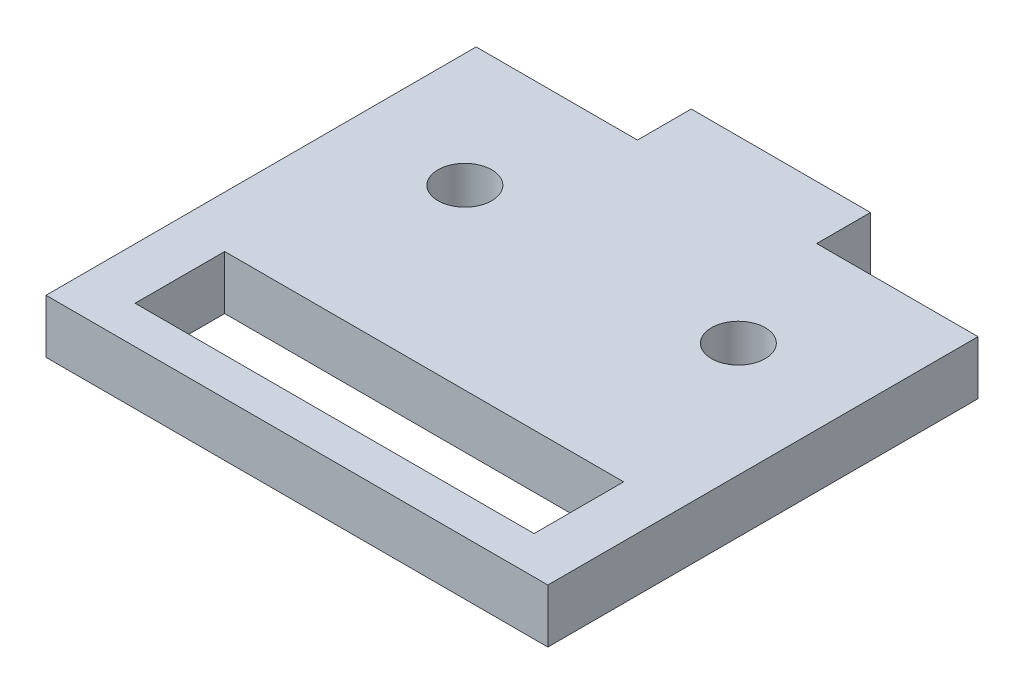
ISO-10303-21;
HEADER;
FILE_DESCRIPTION(('STEP AP214'),'2;1');
FILE_NAME('part.step','',(''),(''),'','','');
FILE_SCHEMA(('AUTOMOTIVE_DESIGN { 1 0 10303 214 1 1 1 1 }'));
ENDSEC;
DATA;
#1=APPLICATION_CONTEXT('core data for automotive mechanical design processes');
#2=APPLICATION_PROTOCOL_DEFINITION('international standard','automotive_design',2000,#1);
#3=PRODUCT_CONTEXT('',#1,'mechanical');
#4=PRODUCT('Part','Part','',(#3));
#5=PRODUCT_RELATED_PRODUCT_CATEGORY('part','',(#4));
#6=PRODUCT_DEFINITION_FORMATION('','',#4);
#7=PRODUCT_DEFINITION_CONTEXT('part definition',#1,'design');
#8=PRODUCT_DEFINITION('design','',#6,#7);
#9=PRODUCT_DEFINITION_SHAPE('','',#8);
#10=(LENGTH_UNIT() NAMED_UNIT(*) SI_UNIT(.MILLI.,.METRE.));
#11=(NAMED_UNIT(*) PLANE_ANGLE_UNIT() SI_UNIT($,.RADIAN.));
#12=(NAMED_UNIT(*) SI_UNIT($,.STERADIAN.) SOLID_ANGLE_UNIT());
#13=UNCERTAINTY_MEASURE_WITH_UNIT(LENGTH_MEASURE(1.E-05),#10,'distance_accuracy_value','');
#14=(GEOMETRIC_REPRESENTATION_CONTEXT(3) GLOBAL_UNCERTAINTY_ASSIGNED_CONTEXT((#13)) GLOBAL_UNIT_ASSIGNED_CONTEXT((#10,
#11,#12)) REPRESENTATION_CONTEXT('',''));
#15=CARTESIAN_POINT('',(0.,0.,0.));
#16=DIRECTION('',(0.,0.,1.));
#17=DIRECTION('',(1.,0.,0.));
#18=AXIS2_PLACEMENT_3D('',#15,#16,#17);
#19=CARTESIAN_POINT('',(0.,3.,0.));
#20=DIRECTION('',(0.,1.,0.));
#21=DIRECTION('',(0.,0.,1.));
#22=AXIS2_PLACEMENT_3D('',#19,#20,#21);
#23=PLANE('',#22);
#24=DIRECTION('',(0.,0.,-1.));
#25=VECTOR('',#24,1.);
#26=CARTESIAN_POINT('',(11.13,3.,-5.10000000000001));
#27=LINE('',#26,#25);
#28=CARTESIAN_POINT('',(11.13,3.,-5.10000000000001));
#29=VERTEX_POINT('',#28);
#30=CARTESIAN_POINT('',(11.13,3.,-10.1));
#31=VERTEX_POINT('',#30);
#32=EDGE_CURVE('E130',#29,#31,#27,.T.);
#33=ORIENTED_EDGE('',*,*,#32,.F.);
#34=DIRECTION('',(1.,0.,0.));
#35=VECTOR('',#34,1.);
#36=CARTESIAN_POINT('',(-11.13,3.,-5.1));
#37=LINE('',#36,#35);
#38=CARTESIAN_POINT('',(-11.13,3.,-5.1));
#39=VERTEX_POINT('',#38);
#40=EDGE_CURVE('E122',#39,#29,#37,.T.);
#41=ORIENTED_EDGE('',*,*,#40,.F.);
#42=DIRECTION('',(0.,0.,1.));
#43=VECTOR('',#42,1.);
#44=CARTESIAN_POINT('',(-11.13,3.,-5.1));
#45=LINE('',#44,#43);
#46=CARTESIAN_POINT('',(-11.13,3.,-10.1));
#47=VERTEX_POINT('',#46);
#48=EDGE_CURVE('E145',#47,#39,#45,.T.);
#49=ORIENTED_EDGE('',*,*,#48,.F.);
#50=DIRECTION('',(-1.,0.,0.));
#51=VECTOR('',#50,1.);
#52=CARTESIAN_POINT('',(11.13,3.,-10.1));
#53=LINE('',#52,#51);
#54=EDGE_CURVE('E143',#31,#47,#53,.T.);
#55=ORIENTED_EDGE('',*,*,#54,.F.);
#56=EDGE_LOOP('',(#33,#41,#49,#55));
#57=FACE_BOUND('',#56,.T.);
#58=CARTESIAN_POINT('',(7.63,3.,-20.));
#59=DIRECTION('',(0.,1.,0.));
#60=DIRECTION('',(0.,0.,1.));
#61=AXIS2_PLACEMENT_3D('',#58,#59,#60);
#62=CIRCLE('',#61,1.5);
#63=CARTESIAN_POINT('',(7.63,3.,-18.5));
#64=VERTEX_POINT('',#63);
#65=EDGE_CURVE('E161',#64,#64,#62,.T.);
#66=ORIENTED_EDGE('',*,*,#65,.F.);
#67=EDGE_LOOP('',(#66));
#68=FACE_BOUND('',#67,.T.);
#69=DIRECTION('',(1.,0.,0.));
#70=VECTOR('',#69,1.);
#71=CARTESIAN_POINT('',(5.,3.,-3.));
#72=LINE('',#71,#70);
#73=CARTESIAN_POINT('',(-14.,3.,-3.));
#74=VERTEX_POINT('',#73);
#75=CARTESIAN_POINT('',(14.,3.,-3.));
#76=VERTEX_POINT('',#75);
#77=EDGE_CURVE('E167',#74,#76,#72,.T.);
#78=ORIENTED_EDGE('',*,*,#77,.T.);
#79=DIRECTION('',(0.,0.,-1.));
#80=VECTOR('',#79,1.);
#81=CARTESIAN_POINT('',(14.,3.,-3.));
#82=LINE('',#81,#80);
#83=CARTESIAN_POINT('',(14.,3.,-27.));
#84=VERTEX_POINT('',#83);
#85=EDGE_CURVE('E170',#76,#84,#82,.T.);
#86=ORIENTED_EDGE('',*,*,#85,.T.);
#87=DIRECTION('',(-1.,0.,0.));
#88=VECTOR('',#87,1.);
#89=CARTESIAN_POINT('',(14.,3.,-27.));
#90=LINE('',#89,#88);
#91=CARTESIAN_POINT('',(4.99999999999999,3.,-27.));
#92=VERTEX_POINT('',#91);
#93=EDGE_CURVE('E173',#84,#92,#90,.T.);
#94=ORIENTED_EDGE('',*,*,#93,.T.);
#95=DIRECTION('',(0.,0.,-1.));
#96=VECTOR('',#95,1.);
#97=CARTESIAN_POINT('',(4.99999999999999,3.,-27.));
#98=LINE('',#97,#96);
#99=CARTESIAN_POINT('',(4.99999999999999,3.,-30.));
#100=VERTEX_POINT('',#99);
#101=EDGE_CURVE('E175',#92,#100,#98,.T.);
#102=ORIENTED_EDGE('',*,*,#101,.T.);
#103=DIRECTION('',(-1.,0.,0.));
#104=VECTOR('',#103,1.);
#105=CARTESIAN_POINT('',(4.99999999999999,3.,-30.));
#106=LINE('',#105,#104);
#107=CARTESIAN_POINT('',(-5.00000000000002,3.,-30.));
#108=VERTEX_POINT('',#107);
#109=EDGE_CURVE('E177',#100,#108,#106,.T.);
#110=ORIENTED_EDGE('',*,*,#109,.T.);
#111=DIRECTION('',(0.,0.,1.));
#112=VECTOR('',#111,1.);
#113=CARTESIAN_POINT('',(-5.00000000000002,3.,-30.));
#114=LINE('',#113,#112);
#115=CARTESIAN_POINT('',(-5.00000000000002,3.,-27.));
#116=VERTEX_POINT('',#115);
#117=EDGE_CURVE('E179',#108,#116,#114,.T.);
#118=ORIENTED_EDGE('',*,*,#117,.T.);
#119=DIRECTION('',(-1.,0.,0.));
#120=VECTOR('',#119,1.);
#121=CARTESIAN_POINT('',(-5.00000000000002,3.,-27.));
#122=LINE('',#121,#120);
#123=CARTESIAN_POINT('',(-14.,3.,-27.));
#124=VERTEX_POINT('',#123);
#125=EDGE_CURVE('E181',#116,#124,#122,.T.);
#126=ORIENTED_EDGE('',*,*,#125,.T.);
#127=DIRECTION('',(0.,0.,1.));
#128=VECTOR('',#127,1.);
#129=CARTESIAN_POINT('',(-14.,3.,-3.));
#130=LINE('',#129,#128);
#131=EDGE_CURVE('E183',#124,#74,#130,.T.);
#132=ORIENTED_EDGE('',*,*,#131,.T.);
#133=EDGE_LOOP('',(#78,#86,#94,#102,#110,#118,#126,#132));
#134=FACE_BOUND('',#133,.T.);
#135=CARTESIAN_POINT('',(-7.63000000000001,3.,-20.));
#136=DIRECTION('',(0.,1.,0.));
#137=DIRECTION('',(0.,0.,-1.));
#138=AXIS2_PLACEMENT_3D('',#135,#136,#137);
#139=CIRCLE('',#138,1.5);
#140=CARTESIAN_POINT('',(-7.63000000000001,3.,-21.5));
#141=VERTEX_POINT('',#140);
#142=EDGE_CURVE('E151',#141,#141,#139,.T.);
#143=ORIENTED_EDGE('',*,*,#142,.F.);
#144=EDGE_LOOP('',(#143));
#145=FACE_BOUND('',#144,.T.);
#146=ADVANCED_FACE('F33',(#57,#68,#134,#145),#23,.T.);
#147=CARTESIAN_POINT('',(0.,0.,0.));
#148=DIRECTION('',(0.,1.,0.));
#149=DIRECTION('',(0.,0.,1.));
#150=AXIS2_PLACEMENT_3D('',#147,#148,#149);
#151=PLANE('',#150);
#152=CARTESIAN_POINT('',(7.63,0.,-20.));
#153=DIRECTION('',(0.,1.,0.));
#154=DIRECTION('',(0.,0.,1.));
#155=AXIS2_PLACEMENT_3D('',#152,#153,#154);
#156=CIRCLE('',#155,1.5);
#157=CARTESIAN_POINT('',(7.63,0.,-18.5));
#158=VERTEX_POINT('',#157);
#159=EDGE_CURVE('E138',#158,#158,#156,.T.);
#160=ORIENTED_EDGE('',*,*,#159,.T.);
#161=EDGE_LOOP('',(#160));
#162=FACE_BOUND('',#161,.T.);
#163=DIRECTION('',(0.,0.,-1.));
#164=VECTOR('',#163,1.);
#165=CARTESIAN_POINT('',(14.,0.,-3.));
#166=LINE('',#165,#164);
#167=CARTESIAN_POINT('',(14.,0.,-3.));
#168=VERTEX_POINT('',#167);
#169=CARTESIAN_POINT('',(14.,0.,-27.));
#170=VERTEX_POINT('',#169);
#171=EDGE_CURVE('E164',#168,#170,#166,.T.);
#172=ORIENTED_EDGE('',*,*,#171,.F.);
#173=DIRECTION('',(1.,0.,0.));
#174=VECTOR('',#173,1.);
#175=CARTESIAN_POINT('',(-5.,0.,-3.));
#176=LINE('',#175,#174);
#177=CARTESIAN_POINT('',(-14.,0.,-3.));
#178=VERTEX_POINT('',#177);
#179=EDGE_CURVE('E171',#178,#168,#176,.T.);
#180=ORIENTED_EDGE('',*,*,#179,.F.);
#181=DIRECTION('',(0.,0.,1.));
#182=VECTOR('',#181,1.);
#183=CARTESIAN_POINT('',(-14.,0.,-3.));
#184=LINE('',#183,#182);
#185=CARTESIAN_POINT('',(-14.,0.,-27.));
#186=VERTEX_POINT('',#185);
#187=EDGE_CURVE('E198',#186,#178,#184,.T.);
#188=ORIENTED_EDGE('',*,*,#187,.F.);
#189=DIRECTION('',(-1.,0.,0.));
#190=VECTOR('',#189,1.);
#191=CARTESIAN_POINT('',(-5.00000000000002,0.,-27.));
#192=LINE('',#191,#190);
#193=CARTESIAN_POINT('',(-5.00000000000002,0.,-27.));
#194=VERTEX_POINT('',#193);
#195=EDGE_CURVE('E196',#194,#186,#192,.T.);
#196=ORIENTED_EDGE('',*,*,#195,.F.);
#197=DIRECTION('',(0.,0.,1.));
#198=VECTOR('',#197,1.);
#199=CARTESIAN_POINT('',(-5.00000000000002,0.,-30.));
#200=LINE('',#199,#198);
#201=CARTESIAN_POINT('',(-5.00000000000002,0.,-30.));
#202=VERTEX_POINT('',#201);
#203=EDGE_CURVE('E194',#202,#194,#200,.T.);
#204=ORIENTED_EDGE('',*,*,#203,.F.);
#205=DIRECTION('',(-1.,0.,0.));
#206=VECTOR('',#205,1.);
#207=CARTESIAN_POINT('',(4.99999999999999,0.,-30.));
#208=LINE('',#207,#206);
#209=CARTESIAN_POINT('',(4.99999999999999,0.,-30.));
#210=VERTEX_POINT('',#209);
#211=EDGE_CURVE('E192',#210,#202,#208,.T.);
#212=ORIENTED_EDGE('',*,*,#211,.F.);
#213=DIRECTION('',(0.,0.,-1.));
#214=VECTOR('',#213,1.);
#215=CARTESIAN_POINT('',(4.99999999999999,0.,-27.));
#216=LINE('',#215,#214);
#217=CARTESIAN_POINT('',(4.99999999999999,0.,-27.));
#218=VERTEX_POINT('',#217);
#219=EDGE_CURVE('E190',#218,#210,#216,.T.);
#220=ORIENTED_EDGE('',*,*,#219,.F.);
#221=DIRECTION('',(-1.,0.,0.));
#222=VECTOR('',#221,1.);
#223=CARTESIAN_POINT('',(14.,0.,-27.));
#224=LINE('',#223,#222);
#225=EDGE_CURVE('E188',#170,#218,#224,.T.);
#226=ORIENTED_EDGE('',*,*,#225,.F.);
#227=EDGE_LOOP('',(#172,#180,#188,#196,#204,#212,#220,#226));
#228=FACE_BOUND('',#227,.T.);
#229=DIRECTION('',(1.,0.,0.));
#230=VECTOR('',#229,1.);
#231=CARTESIAN_POINT('',(-11.13,0.,-5.1));
#232=LINE('',#231,#230);
#233=CARTESIAN_POINT('',(-11.13,0.,-5.1));
#234=VERTEX_POINT('',#233);
#235=CARTESIAN_POINT('',(11.13,0.,-5.10000000000001));
#236=VERTEX_POINT('',#235);
#237=EDGE_CURVE('E56',#234,#236,#232,.T.);
#238=ORIENTED_EDGE('',*,*,#237,.T.);
#239=DIRECTION('',(0.,0.,-1.));
#240=VECTOR('',#239,1.);
#241=CARTESIAN_POINT('',(11.13,0.,-5.10000000000001));
#242=LINE('',#241,#240);
#243=CARTESIAN_POINT('',(11.13,0.,-10.1));
#244=VERTEX_POINT('',#243);
#245=EDGE_CURVE('E137',#236,#244,#242,.T.);
#246=ORIENTED_EDGE('',*,*,#245,.T.);
#247=DIRECTION('',(-1.,0.,0.));
#248=VECTOR('',#247,1.);
#249=CARTESIAN_POINT('',(11.13,0.,-10.1));
#250=LINE('',#249,#248);
#251=CARTESIAN_POINT('',(-11.13,0.,-10.1));
#252=VERTEX_POINT('',#251);
#253=EDGE_CURVE('E153',#244,#252,#250,.T.);
#254=ORIENTED_EDGE('',*,*,#253,.T.);
#255=DIRECTION('',(0.,0.,1.));
#256=VECTOR('',#255,1.);
#257=CARTESIAN_POINT('',(-11.13,0.,-5.1));
#258=LINE('',#257,#256);
#259=EDGE_CURVE('E131',#252,#234,#258,.T.);
#260=ORIENTED_EDGE('',*,*,#259,.T.);
#261=EDGE_LOOP('',(#238,#246,#254,#260));
#262=FACE_BOUND('',#261,.T.);
#263=CARTESIAN_POINT('',(-7.63000000000001,0.,-20.));
#264=DIRECTION('',(0.,1.,0.));
#265=DIRECTION('',(0.,0.,-1.));
#266=AXIS2_PLACEMENT_3D('',#263,#264,#265);
#267=CIRCLE('',#266,1.5);
#268=CARTESIAN_POINT('',(-7.63000000000001,0.,-21.5));
#269=VERTEX_POINT('',#268);
#270=EDGE_CURVE('E405',#269,#269,#267,.T.);
#271=ORIENTED_EDGE('',*,*,#270,.T.);
#272=EDGE_LOOP('',(#271));
#273=FACE_BOUND('',#272,.T.);
#274=ADVANCED_FACE('F229',(#162,#228,#262,#273),#151,.F.);
#275=CARTESIAN_POINT('',(14.,3.,-3.));
#276=DIRECTION('',(-1.,0.,0.));
#277=DIRECTION('',(0.,0.,1.));
#278=AXIS2_PLACEMENT_3D('',#275,#276,#277);
#279=PLANE('',#278);
#280=ORIENTED_EDGE('',*,*,#171,.T.);
#281=DIRECTION('',(0.,-1.,0.));
#282=VECTOR('',#281,1.);
#283=CARTESIAN_POINT('',(14.,3.,-27.));
#284=LINE('',#283,#282);
#285=EDGE_CURVE('E41',#84,#170,#284,.T.);
#286=ORIENTED_EDGE('',*,*,#285,.F.);
#287=ORIENTED_EDGE('',*,*,#85,.F.);
#288=DIRECTION('',(0.,-1.,0.));
#289=VECTOR('',#288,1.);
#290=CARTESIAN_POINT('',(14.,3.,-3.));
#291=LINE('',#290,#289);
#292=EDGE_CURVE('E11',#76,#168,#291,.T.);
#293=ORIENTED_EDGE('',*,*,#292,.T.);
#294=EDGE_LOOP('',(#280,#286,#287,#293));
#295=FACE_BOUND('',#294,.T.);
#296=ADVANCED_FACE('F35',(#295),#279,.F.);
#297=CARTESIAN_POINT('',(14.,3.,-27.));
#298=DIRECTION('',(0.,0.,1.));
#299=DIRECTION('',(1.,0.,0.));
#300=AXIS2_PLACEMENT_3D('',#297,#298,#299);
#301=PLANE('',#300);
#302=ORIENTED_EDGE('',*,*,#225,.T.);
#303=DIRECTION('',(0.,-1.,0.));
#304=VECTOR('',#303,1.);
#305=CARTESIAN_POINT('',(4.99999999999999,3.,-27.));
#306=LINE('',#305,#304);
#307=EDGE_CURVE('E216',#92,#218,#306,.T.);
#308=ORIENTED_EDGE('',*,*,#307,.F.);
#309=ORIENTED_EDGE('',*,*,#93,.F.);
#310=ORIENTED_EDGE('',*,*,#285,.T.);
#311=EDGE_LOOP('',(#302,#308,#309,#310));
#312=FACE_BOUND('',#311,.T.);
#313=ADVANCED_FACE('F223',(#312),#301,.F.);
#314=CARTESIAN_POINT('',(4.99999999999999,3.,-27.));
#315=DIRECTION('',(-1.,0.,0.));
#316=DIRECTION('',(0.,0.,1.));
#317=AXIS2_PLACEMENT_3D('',#314,#315,#316);
#318=PLANE('',#317);
#319=ORIENTED_EDGE('',*,*,#219,.T.);
#320=DIRECTION('',(0.,-1.,0.));
#321=VECTOR('',#320,1.);
#322=CARTESIAN_POINT('',(4.99999999999999,3.,-30.));
#323=LINE('',#322,#321);
#324=EDGE_CURVE('E213',#100,#210,#323,.T.);
#325=ORIENTED_EDGE('',*,*,#324,.F.);
#326=ORIENTED_EDGE('',*,*,#101,.F.);
#327=ORIENTED_EDGE('',*,*,#307,.T.);
#328=EDGE_LOOP('',(#319,#325,#326,#327));
#329=FACE_BOUND('',#328,.T.);
#330=ADVANCED_FACE('F235',(#329),#318,.F.);
#331=CARTESIAN_POINT('',(4.99999999999999,3.,-30.));
#332=DIRECTION('',(0.,0.,1.));
#333=DIRECTION('',(1.,0.,0.));
#334=AXIS2_PLACEMENT_3D('',#331,#332,#333);
#335=PLANE('',#334);
#336=ORIENTED_EDGE('',*,*,#211,.T.);
#337=DIRECTION('',(0.,-1.,0.));
#338=VECTOR('',#337,1.);
#339=CARTESIAN_POINT('',(-5.00000000000002,3.,-30.));
#340=LINE('',#339,#338);
#341=EDGE_CURVE('E210',#108,#202,#340,.T.);
#342=ORIENTED_EDGE('',*,*,#341,.F.);
#343=ORIENTED_EDGE('',*,*,#109,.F.);
#344=ORIENTED_EDGE('',*,*,#324,.T.);
#345=EDGE_LOOP('',(#336,#342,#343,#344));
#346=FACE_BOUND('',#345,.T.);
#347=ADVANCED_FACE('F239',(#346),#335,.F.);
#348=CARTESIAN_POINT('',(-5.00000000000002,3.,-30.));
#349=DIRECTION('',(1.,0.,0.));
#350=DIRECTION('',(0.,0.,-1.));
#351=AXIS2_PLACEMENT_3D('',#348,#349,#350);
#352=PLANE('',#351);
#353=ORIENTED_EDGE('',*,*,#203,.T.);
#354=DIRECTION('',(0.,-1.,0.));
#355=VECTOR('',#354,1.);
#356=CARTESIAN_POINT('',(-5.00000000000002,3.,-27.));
#357=LINE('',#356,#355);
#358=EDGE_CURVE('E207',#116,#194,#357,.T.);
#359=ORIENTED_EDGE('',*,*,#358,.F.);
#360=ORIENTED_EDGE('',*,*,#117,.F.);
#361=ORIENTED_EDGE('',*,*,#341,.T.);
#362=EDGE_LOOP('',(#353,#359,#360,#361));
#363=FACE_BOUND('',#362,.T.);
#364=ADVANCED_FACE('F259',(#363),#352,.F.);
#365=CARTESIAN_POINT('',(-5.00000000000002,3.,-27.));
#366=DIRECTION('',(0.,0.,1.));
#367=DIRECTION('',(1.,0.,0.));
#368=AXIS2_PLACEMENT_3D('',#365,#366,#367);
#369=PLANE('',#368);
#370=ORIENTED_EDGE('',*,*,#195,.T.);
#371=DIRECTION('',(0.,-1.,0.));
#372=VECTOR('',#371,1.);
#373=CARTESIAN_POINT('',(-14.,3.,-27.));
#374=LINE('',#373,#372);
#375=EDGE_CURVE('E204',#124,#186,#374,.T.);
#376=ORIENTED_EDGE('',*,*,#375,.F.);
#377=ORIENTED_EDGE('',*,*,#125,.F.);
#378=ORIENTED_EDGE('',*,*,#358,.T.);
#379=EDGE_LOOP('',(#370,#376,#377,#378));
#380=FACE_BOUND('',#379,.T.);
#381=ADVANCED_FACE('F257',(#380),#369,.F.);
#382=CARTESIAN_POINT('',(-14.,3.,-3.));
#383=DIRECTION('',(1.,0.,0.));
#384=DIRECTION('',(0.,0.,-1.));
#385=AXIS2_PLACEMENT_3D('',#382,#383,#384);
#386=PLANE('',#385);
#387=ORIENTED_EDGE('',*,*,#187,.T.);
#388=DIRECTION('',(0.,-1.,0.));
#389=VECTOR('',#388,1.);
#390=CARTESIAN_POINT('',(-14.,3.,-3.));
#391=LINE('',#390,#389);
#392=EDGE_CURVE('E186',#74,#178,#391,.T.);
#393=ORIENTED_EDGE('',*,*,#392,.F.);
#394=ORIENTED_EDGE('',*,*,#131,.F.);
#395=ORIENTED_EDGE('',*,*,#375,.T.);
#396=EDGE_LOOP('',(#387,#393,#394,#395));
#397=FACE_BOUND('',#396,.T.);
#398=ADVANCED_FACE('F252',(#397),#386,.F.);
#399=CARTESIAN_POINT('',(-5.,3.,-3.));
#400=DIRECTION('',(0.,0.,-1.));
#401=DIRECTION('',(-1.,0.,0.));
#402=AXIS2_PLACEMENT_3D('',#399,#400,#401);
#403=PLANE('',#402);
#404=ORIENTED_EDGE('',*,*,#179,.T.);
#405=ORIENTED_EDGE('',*,*,#292,.F.);
#406=ORIENTED_EDGE('',*,*,#77,.F.);
#407=ORIENTED_EDGE('',*,*,#392,.T.);
#408=EDGE_LOOP('',(#404,#405,#406,#407));
#409=FACE_BOUND('',#408,.T.);
#410=ADVANCED_FACE('F247',(#409),#403,.F.);
#411=CARTESIAN_POINT('',(7.63,3.,-20.));
#412=DIRECTION('',(0.,-1.,0.));
#413=DIRECTION('',(0.,0.,-1.));
#414=AXIS2_PLACEMENT_3D('',#411,#412,#413);
#415=CYLINDRICAL_SURFACE('',#414,1.5);
#416=ORIENTED_EDGE('',*,*,#65,.T.);
#417=EDGE_LOOP('',(#416));
#418=FACE_BOUND('',#417,.T.);
#419=ORIENTED_EDGE('',*,*,#159,.F.);
#420=EDGE_LOOP('',(#419));
#421=FACE_BOUND('',#420,.T.);
#422=ADVANCED_FACE('F276',(#418,#421),#415,.F.);
#423=CARTESIAN_POINT('',(-11.13,3.,-5.1));
#424=DIRECTION('',(0.,0.,-1.));
#425=DIRECTION('',(-1.,0.,0.));
#426=AXIS2_PLACEMENT_3D('',#423,#424,#425);
#427=PLANE('',#426);
#428=ORIENTED_EDGE('',*,*,#237,.F.);
#429=DIRECTION('',(0.,-1.,0.));
#430=VECTOR('',#429,1.);
#431=CARTESIAN_POINT('',(-11.13,3.,-5.1));
#432=LINE('',#431,#430);
#433=EDGE_CURVE('E126',#39,#234,#432,.T.);
#434=ORIENTED_EDGE('',*,*,#433,.F.);
#435=ORIENTED_EDGE('',*,*,#40,.T.);
#436=DIRECTION('',(0.,-1.,0.));
#437=VECTOR('',#436,1.);
#438=CARTESIAN_POINT('',(11.13,3.,-5.10000000000001));
#439=LINE('',#438,#437);
#440=EDGE_CURVE('E125',#29,#236,#439,.T.);
#441=ORIENTED_EDGE('',*,*,#440,.T.);
#442=EDGE_LOOP('',(#428,#434,#435,#441));
#443=FACE_BOUND('',#442,.T.);
#444=ADVANCED_FACE('F124',(#443),#427,.T.);
#445=CARTESIAN_POINT('',(11.13,3.,-5.10000000000001));
#446=DIRECTION('',(-1.,0.,0.));
#447=DIRECTION('',(0.,0.,1.));
#448=AXIS2_PLACEMENT_3D('',#445,#446,#447);
#449=PLANE('',#448);
#450=ORIENTED_EDGE('',*,*,#245,.F.);
#451=ORIENTED_EDGE('',*,*,#440,.F.);
#452=ORIENTED_EDGE('',*,*,#32,.T.);
#453=DIRECTION('',(0.,-1.,0.));
#454=VECTOR('',#453,1.);
#455=CARTESIAN_POINT('',(11.13,3.,-10.1));
#456=LINE('',#455,#454);
#457=EDGE_CURVE('E139',#31,#244,#456,.T.);
#458=ORIENTED_EDGE('',*,*,#457,.T.);
#459=EDGE_LOOP('',(#450,#451,#452,#458));
#460=FACE_BOUND('',#459,.T.);
#461=ADVANCED_FACE('F134',(#460),#449,.T.);
#462=CARTESIAN_POINT('',(11.13,3.,-10.1));
#463=DIRECTION('',(0.,0.,1.));
#464=DIRECTION('',(1.,0.,0.));
#465=AXIS2_PLACEMENT_3D('',#462,#463,#464);
#466=PLANE('',#465);
#467=ORIENTED_EDGE('',*,*,#253,.F.);
#468=ORIENTED_EDGE('',*,*,#457,.F.);
#469=ORIENTED_EDGE('',*,*,#54,.T.);
#470=DIRECTION('',(0.,-1.,0.));
#471=VECTOR('',#470,1.);
#472=CARTESIAN_POINT('',(-11.13,3.,-10.1));
#473=LINE('',#472,#471);
#474=EDGE_CURVE('E48',#47,#252,#473,.T.);
#475=ORIENTED_EDGE('',*,*,#474,.T.);
#476=EDGE_LOOP('',(#467,#468,#469,#475));
#477=FACE_BOUND('',#476,.T.);
#478=ADVANCED_FACE('F307',(#477),#466,.T.);
#479=CARTESIAN_POINT('',(-11.13,3.,-5.1));
#480=DIRECTION('',(1.,0.,0.));
#481=DIRECTION('',(0.,0.,-1.));
#482=AXIS2_PLACEMENT_3D('',#479,#480,#481);
#483=PLANE('',#482);
#484=ORIENTED_EDGE('',*,*,#259,.F.);
#485=ORIENTED_EDGE('',*,*,#474,.F.);
#486=ORIENTED_EDGE('',*,*,#48,.T.);
#487=ORIENTED_EDGE('',*,*,#433,.T.);
#488=EDGE_LOOP('',(#484,#485,#486,#487));
#489=FACE_BOUND('',#488,.T.);
#490=ADVANCED_FACE('F314',(#489),#483,.T.);
#491=CARTESIAN_POINT('',(-7.63000000000001,3.,-20.));
#492=DIRECTION('',(0.,-1.,0.));
#493=DIRECTION('',(0.,0.,-1.));
#494=AXIS2_PLACEMENT_3D('',#491,#492,#493);
#495=CYLINDRICAL_SURFACE('',#494,1.5);
#496=ORIENTED_EDGE('',*,*,#142,.T.);
#497=EDGE_LOOP('',(#496));
#498=FACE_BOUND('',#497,.T.);
#499=ORIENTED_EDGE('',*,*,#270,.F.);
#500=EDGE_LOOP('',(#499));
#501=FACE_BOUND('',#500,.T.);
#502=ADVANCED_FACE('F322',(#498,#501),#495,.F.);
#503=CLOSED_SHELL('',(#146,#274,#296,#313,#330,#347,#364,#381,#398,#410,#422,#444,#461,#478,
#490,#502));
#504=MANIFOLD_SOLID_BREP('B2',#503);
#505=ADVANCED_BREP_SHAPE_REPRESENTATION('',(#18,#504),#14);
#506=SHAPE_DEFINITION_REPRESENTATION(#9,#505);
ENDSEC;
END-ISO-10303-21;
